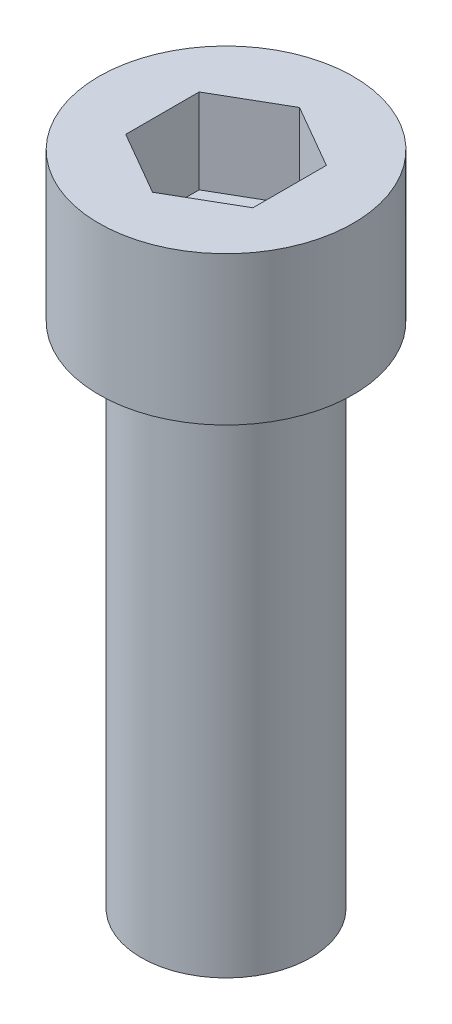
ISO-10303-21;
HEADER;
FILE_DESCRIPTION(('STEP AP214'),'2;1');
FILE_NAME('part.step','',(''),(''),'','','');
FILE_SCHEMA(('AUTOMOTIVE_DESIGN { 1 0 10303 214 1 1 1 1 }'));
ENDSEC;
DATA;
#1=APPLICATION_CONTEXT('core data for automotive mechanical design processes');
#2=APPLICATION_PROTOCOL_DEFINITION('international standard','automotive_design',2000,#1);
#3=PRODUCT_CONTEXT('',#1,'mechanical');
#4=PRODUCT('Part','Part','',(#3));
#5=PRODUCT_RELATED_PRODUCT_CATEGORY('part','',(#4));
#6=PRODUCT_DEFINITION_FORMATION('','',#4);
#7=PRODUCT_DEFINITION_CONTEXT('part definition',#1,'design');
#8=PRODUCT_DEFINITION('design','',#6,#7);
#9=PRODUCT_DEFINITION_SHAPE('','',#8);
#10=(LENGTH_UNIT() NAMED_UNIT(*) SI_UNIT(.MILLI.,.METRE.));
#11=(NAMED_UNIT(*) PLANE_ANGLE_UNIT() SI_UNIT($,.RADIAN.));
#12=(NAMED_UNIT(*) SI_UNIT($,.STERADIAN.) SOLID_ANGLE_UNIT());
#13=UNCERTAINTY_MEASURE_WITH_UNIT(LENGTH_MEASURE(1.E-05),#10,'distance_accuracy_value','');
#14=(GEOMETRIC_REPRESENTATION_CONTEXT(3) GLOBAL_UNCERTAINTY_ASSIGNED_CONTEXT((#13)) GLOBAL_UNIT_ASSIGNED_CONTEXT((#10,
#11,#12)) REPRESENTATION_CONTEXT('',''));
#15=CARTESIAN_POINT('',(0.,0.,0.));
#16=DIRECTION('',(0.,0.,1.));
#17=DIRECTION('',(1.,0.,0.));
#18=AXIS2_PLACEMENT_3D('',#15,#16,#17);
#19=CARTESIAN_POINT('',(3.,15.5,0.));
#20=DIRECTION('',(0.,-1.,0.));
#21=DIRECTION('',(1.,0.,0.));
#22=AXIS2_PLACEMENT_3D('',#19,#20,#21);
#23=PLANE('',#22);
#24=DIRECTION('',(0.866025403784438,0.,-0.5));
#25=VECTOR('',#24,1.);
#26=CARTESIAN_POINT('',(0.,15.5,1.73205080756888));
#27=LINE('',#26,#25);
#28=CARTESIAN_POINT('',(0.,15.5,1.73205080756888));
#29=VERTEX_POINT('',#28);
#30=CARTESIAN_POINT('',(1.5,15.5,0.866025403784438));
#31=VERTEX_POINT('',#30);
#32=EDGE_CURVE('E121',#29,#31,#27,.T.);
#33=ORIENTED_EDGE('',*,*,#32,.F.);
#34=DIRECTION('',(0.866025403784438,0.,0.5));
#35=VECTOR('',#34,1.);
#36=CARTESIAN_POINT('',(-1.5,15.5,0.866025403784438));
#37=LINE('',#36,#35);
#38=CARTESIAN_POINT('',(-1.5,15.5,0.866025403784438));
#39=VERTEX_POINT('',#38);
#40=EDGE_CURVE('E47',#39,#29,#37,.T.);
#41=ORIENTED_EDGE('',*,*,#40,.F.);
#42=DIRECTION('',(0.,0.,1.));
#43=VECTOR('',#42,1.);
#44=CARTESIAN_POINT('',(-1.5,15.5,-0.866025403784439));
#45=LINE('',#44,#43);
#46=CARTESIAN_POINT('',(-1.5,15.5,-0.866025403784439));
#47=VERTEX_POINT('',#46);
#48=EDGE_CURVE('E130',#47,#39,#45,.T.);
#49=ORIENTED_EDGE('',*,*,#48,.F.);
#50=DIRECTION('',(-0.866025403784439,0.,0.5));
#51=VECTOR('',#50,1.);
#52=CARTESIAN_POINT('',(0.,15.5,-1.73205080756888));
#53=LINE('',#52,#51);
#54=CARTESIAN_POINT('',(0.,15.5,-1.73205080756888));
#55=VERTEX_POINT('',#54);
#56=EDGE_CURVE('E128',#55,#47,#53,.T.);
#57=ORIENTED_EDGE('',*,*,#56,.F.);
#58=DIRECTION('',(-0.866025403784439,0.,-0.5));
#59=VECTOR('',#58,1.);
#60=CARTESIAN_POINT('',(1.5,15.5,-0.86602540378444));
#61=LINE('',#60,#59);
#62=CARTESIAN_POINT('',(1.5,15.5,-0.86602540378444));
#63=VERTEX_POINT('',#62);
#64=EDGE_CURVE('E95',#63,#55,#61,.T.);
#65=ORIENTED_EDGE('',*,*,#64,.F.);
#66=DIRECTION('',(0.,0.,-1.));
#67=VECTOR('',#66,1.);
#68=CARTESIAN_POINT('',(1.5,15.5,0.866025403784438));
#69=LINE('',#68,#67);
#70=EDGE_CURVE('E124',#31,#63,#69,.T.);
#71=ORIENTED_EDGE('',*,*,#70,.F.);
#72=EDGE_LOOP('',(#33,#41,#49,#57,#65,#71));
#73=FACE_BOUND('',#72,.T.);
#74=CARTESIAN_POINT('',(0.,15.5,0.));
#75=DIRECTION('',(0.,1.,0.));
#76=DIRECTION('',(-1.,0.,0.));
#77=AXIS2_PLACEMENT_3D('',#74,#75,#76);
#78=CIRCLE('',#77,3.);
#79=CARTESIAN_POINT('',(-3.,15.5,0.));
#80=VERTEX_POINT('',#79);
#81=EDGE_CURVE('E134',#80,#80,#78,.T.);
#82=ORIENTED_EDGE('',*,*,#81,.T.);
#83=EDGE_LOOP('',(#82));
#84=FACE_BOUND('',#83,.T.);
#85=ADVANCED_FACE('F33',(#73,#84),#23,.F.);
#86=CARTESIAN_POINT('',(0.,0.,0.));
#87=DIRECTION('',(0.,1.,0.));
#88=DIRECTION('',(-1.,0.,0.));
#89=AXIS2_PLACEMENT_3D('',#86,#87,#88);
#90=PLANE('',#89);
#91=CARTESIAN_POINT('',(0.,0.,0.));
#92=DIRECTION('',(0.,1.,0.));
#93=DIRECTION('',(-1.,0.,0.));
#94=AXIS2_PLACEMENT_3D('',#91,#92,#93);
#95=CIRCLE('',#94,2.);
#96=CARTESIAN_POINT('',(-2.,0.,0.));
#97=VERTEX_POINT('',#96);
#98=EDGE_CURVE('E11',#97,#97,#95,.T.);
#99=ORIENTED_EDGE('',*,*,#98,.F.);
#100=EDGE_LOOP('',(#99));
#101=FACE_BOUND('',#100,.T.);
#102=ADVANCED_FACE('F152',(#101),#90,.F.);
#103=CARTESIAN_POINT('',(0.,15.5,0.));
#104=DIRECTION('',(0.,1.,0.));
#105=DIRECTION('',(-1.,0.,0.));
#106=AXIS2_PLACEMENT_3D('',#103,#104,#105);
#107=CYLINDRICAL_SURFACE('',#106,2.);
#108=CARTESIAN_POINT('',(0.,12.,0.));
#109=DIRECTION('',(0.,1.,0.));
#110=DIRECTION('',(-1.,0.,0.));
#111=AXIS2_PLACEMENT_3D('',#108,#109,#110);
#112=CIRCLE('',#111,2.);
#113=CARTESIAN_POINT('',(-2.,12.,0.));
#114=VERTEX_POINT('',#113);
#115=EDGE_CURVE('E40',#114,#114,#112,.T.);
#116=ORIENTED_EDGE('',*,*,#115,.F.);
#117=EDGE_LOOP('',(#116));
#118=FACE_BOUND('',#117,.T.);
#119=ORIENTED_EDGE('',*,*,#98,.T.);
#120=EDGE_LOOP('',(#119));
#121=FACE_BOUND('',#120,.T.);
#122=ADVANCED_FACE('F149',(#118,#121),#107,.T.);
#123=CARTESIAN_POINT('',(2.,12.,0.));
#124=DIRECTION('',(0.,1.,0.));
#125=DIRECTION('',(-1.,0.,0.));
#126=AXIS2_PLACEMENT_3D('',#123,#124,#125);
#127=PLANE('',#126);
#128=CARTESIAN_POINT('',(0.,12.,0.));
#129=DIRECTION('',(0.,1.,0.));
#130=DIRECTION('',(-1.,0.,0.));
#131=AXIS2_PLACEMENT_3D('',#128,#129,#130);
#132=CIRCLE('',#131,3.);
#133=CARTESIAN_POINT('',(-3.,12.,0.));
#134=VERTEX_POINT('',#133);
#135=EDGE_CURVE('E142',#134,#134,#132,.T.);
#136=ORIENTED_EDGE('',*,*,#135,.F.);
#137=EDGE_LOOP('',(#136));
#138=FACE_BOUND('',#137,.T.);
#139=ORIENTED_EDGE('',*,*,#115,.T.);
#140=EDGE_LOOP('',(#139));
#141=FACE_BOUND('',#140,.T.);
#142=ADVANCED_FACE('F147',(#138,#141),#127,.F.);
#143=CARTESIAN_POINT('',(0.,15.5,0.));
#144=DIRECTION('',(0.,1.,0.));
#145=DIRECTION('',(-1.,0.,0.));
#146=AXIS2_PLACEMENT_3D('',#143,#144,#145);
#147=CYLINDRICAL_SURFACE('',#146,3.);
#148=ORIENTED_EDGE('',*,*,#81,.F.);
#149=EDGE_LOOP('',(#148));
#150=FACE_BOUND('',#149,.T.);
#151=ORIENTED_EDGE('',*,*,#135,.T.);
#152=EDGE_LOOP('',(#151));
#153=FACE_BOUND('',#152,.T.);
#154=ADVANCED_FACE('F164',(#150,#153),#147,.T.);
#155=CARTESIAN_POINT('',(-1.5,13.5,0.866025403784438));
#156=DIRECTION('',(-0.5,0.,0.866025403784439));
#157=DIRECTION('',(0.866025403784438,0.,0.5));
#158=AXIS2_PLACEMENT_3D('',#155,#156,#157);
#159=PLANE('',#158);
#160=ORIENTED_EDGE('',*,*,#40,.T.);
#161=DIRECTION('',(0.,1.,0.));
#162=VECTOR('',#161,1.);
#163=CARTESIAN_POINT('',(0.,13.5,1.73205080756888));
#164=LINE('',#163,#162);
#165=CARTESIAN_POINT('',(0.,13.5,1.73205080756888));
#166=VERTEX_POINT('',#165);
#167=EDGE_CURVE('E77',#166,#29,#164,.T.);
#168=ORIENTED_EDGE('',*,*,#167,.F.);
#169=DIRECTION('',(0.866025403784438,0.,0.5));
#170=VECTOR('',#169,1.);
#171=CARTESIAN_POINT('',(-1.5,13.5,0.866025403784438));
#172=LINE('',#171,#170);
#173=CARTESIAN_POINT('',(-1.5,13.5,0.866025403784438));
#174=VERTEX_POINT('',#173);
#175=EDGE_CURVE('E132',#174,#166,#172,.T.);
#176=ORIENTED_EDGE('',*,*,#175,.F.);
#177=DIRECTION('',(0.,1.,0.));
#178=VECTOR('',#177,1.);
#179=CARTESIAN_POINT('',(-1.5,13.5,0.866025403784438));
#180=LINE('',#179,#178);
#181=EDGE_CURVE('E55',#174,#39,#180,.T.);
#182=ORIENTED_EDGE('',*,*,#181,.T.);
#183=EDGE_LOOP('',(#160,#168,#176,#182));
#184=FACE_BOUND('',#183,.T.);
#185=ADVANCED_FACE('F168',(#184),#159,.F.);
#186=CARTESIAN_POINT('',(-1.5,13.5,-0.866025403784439));
#187=DIRECTION('',(-1.,0.,0.));
#188=DIRECTION('',(0.,0.,1.));
#189=AXIS2_PLACEMENT_3D('',#186,#187,#188);
#190=PLANE('',#189);
#191=ORIENTED_EDGE('',*,*,#48,.T.);
#192=ORIENTED_EDGE('',*,*,#181,.F.);
#193=DIRECTION('',(0.,0.,1.));
#194=VECTOR('',#193,1.);
#195=CARTESIAN_POINT('',(-1.5,13.5,-0.866025403784439));
#196=LINE('',#195,#194);
#197=CARTESIAN_POINT('',(-1.5,13.5,-0.866025403784439));
#198=VERTEX_POINT('',#197);
#199=EDGE_CURVE('E107',#198,#174,#196,.T.);
#200=ORIENTED_EDGE('',*,*,#199,.F.);
#201=DIRECTION('',(0.,1.,0.));
#202=VECTOR('',#201,1.);
#203=CARTESIAN_POINT('',(-1.5,13.5,-0.866025403784439));
#204=LINE('',#203,#202);
#205=EDGE_CURVE('E99',#198,#47,#204,.T.);
#206=ORIENTED_EDGE('',*,*,#205,.T.);
#207=EDGE_LOOP('',(#191,#192,#200,#206));
#208=FACE_BOUND('',#207,.T.);
#209=ADVANCED_FACE('F172',(#208),#190,.F.);
#210=CARTESIAN_POINT('',(0.,13.5,-1.73205080756888));
#211=DIRECTION('',(-0.5,0.,-0.866025403784439));
#212=DIRECTION('',(-0.866025403784439,0.,0.5));
#213=AXIS2_PLACEMENT_3D('',#210,#211,#212);
#214=PLANE('',#213);
#215=ORIENTED_EDGE('',*,*,#56,.T.);
#216=ORIENTED_EDGE('',*,*,#205,.F.);
#217=DIRECTION('',(-0.866025403784439,0.,0.5));
#218=VECTOR('',#217,1.);
#219=CARTESIAN_POINT('',(0.,13.5,-1.73205080756888));
#220=LINE('',#219,#218);
#221=CARTESIAN_POINT('',(0.,13.5,-1.73205080756888));
#222=VERTEX_POINT('',#221);
#223=EDGE_CURVE('E103',#222,#198,#220,.T.);
#224=ORIENTED_EDGE('',*,*,#223,.F.);
#225=DIRECTION('',(0.,1.,0.));
#226=VECTOR('',#225,1.);
#227=CARTESIAN_POINT('',(0.,13.5,-1.73205080756888));
#228=LINE('',#227,#226);
#229=EDGE_CURVE('E88',#222,#55,#228,.T.);
#230=ORIENTED_EDGE('',*,*,#229,.T.);
#231=EDGE_LOOP('',(#215,#216,#224,#230));
#232=FACE_BOUND('',#231,.T.);
#233=ADVANCED_FACE('F104',(#232),#214,.F.);
#234=CARTESIAN_POINT('',(1.5,13.5,-0.86602540378444));
#235=DIRECTION('',(0.5,0.,-0.866025403784439));
#236=DIRECTION('',(-0.866025403784439,0.,-0.5));
#237=AXIS2_PLACEMENT_3D('',#234,#235,#236);
#238=PLANE('',#237);
#239=ORIENTED_EDGE('',*,*,#64,.T.);
#240=ORIENTED_EDGE('',*,*,#229,.F.);
#241=DIRECTION('',(-0.866025403784439,0.,-0.5));
#242=VECTOR('',#241,1.);
#243=CARTESIAN_POINT('',(1.5,13.5,-0.86602540378444));
#244=LINE('',#243,#242);
#245=CARTESIAN_POINT('',(1.5,13.5,-0.86602540378444));
#246=VERTEX_POINT('',#245);
#247=EDGE_CURVE('E92',#246,#222,#244,.T.);
#248=ORIENTED_EDGE('',*,*,#247,.F.);
#249=DIRECTION('',(0.,1.,0.));
#250=VECTOR('',#249,1.);
#251=CARTESIAN_POINT('',(1.5,13.5,-0.86602540378444));
#252=LINE('',#251,#250);
#253=EDGE_CURVE('E100',#246,#63,#252,.T.);
#254=ORIENTED_EDGE('',*,*,#253,.T.);
#255=EDGE_LOOP('',(#239,#240,#248,#254));
#256=FACE_BOUND('',#255,.T.);
#257=ADVANCED_FACE('F90',(#256),#238,.F.);
#258=CARTESIAN_POINT('',(1.5,13.5,0.866025403784438));
#259=DIRECTION('',(1.,0.,0.));
#260=DIRECTION('',(0.,1.,0.));
#261=AXIS2_PLACEMENT_3D('',#258,#259,#260);
#262=PLANE('',#261);
#263=ORIENTED_EDGE('',*,*,#70,.T.);
#264=ORIENTED_EDGE('',*,*,#253,.F.);
#265=DIRECTION('',(0.,0.,-1.));
#266=VECTOR('',#265,1.);
#267=CARTESIAN_POINT('',(1.5,13.5,0.866025403784438));
#268=LINE('',#267,#266);
#269=CARTESIAN_POINT('',(1.5,13.5,0.866025403784438));
#270=VERTEX_POINT('',#269);
#271=EDGE_CURVE('E113',#270,#246,#268,.T.);
#272=ORIENTED_EDGE('',*,*,#271,.F.);
#273=DIRECTION('',(0.,1.,0.));
#274=VECTOR('',#273,1.);
#275=CARTESIAN_POINT('',(1.5,13.5,0.866025403784438));
#276=LINE('',#275,#274);
#277=EDGE_CURVE('E137',#270,#31,#276,.T.);
#278=ORIENTED_EDGE('',*,*,#277,.T.);
#279=EDGE_LOOP('',(#263,#264,#272,#278));
#280=FACE_BOUND('',#279,.T.);
#281=ADVANCED_FACE('F176',(#280),#262,.F.);
#282=CARTESIAN_POINT('',(0.,13.5,1.73205080756888));
#283=DIRECTION('',(0.5,0.,0.866025403784438));
#284=DIRECTION('',(0.866025403784438,0.,-0.5));
#285=AXIS2_PLACEMENT_3D('',#282,#283,#284);
#286=PLANE('',#285);
#287=ORIENTED_EDGE('',*,*,#32,.T.);
#288=ORIENTED_EDGE('',*,*,#277,.F.);
#289=DIRECTION('',(0.866025403784438,0.,-0.5));
#290=VECTOR('',#289,1.);
#291=CARTESIAN_POINT('',(0.,13.5,1.73205080756888));
#292=LINE('',#291,#290);
#293=EDGE_CURVE('E115',#166,#270,#292,.T.);
#294=ORIENTED_EDGE('',*,*,#293,.F.);
#295=ORIENTED_EDGE('',*,*,#167,.T.);
#296=EDGE_LOOP('',(#287,#288,#294,#295));
#297=FACE_BOUND('',#296,.T.);
#298=ADVANCED_FACE('F173',(#297),#286,.F.);
#299=CARTESIAN_POINT('',(0.,13.5,0.));
#300=DIRECTION('',(0.,1.,0.));
#301=DIRECTION('',(0.,0.,1.));
#302=AXIS2_PLACEMENT_3D('',#299,#300,#301);
#303=PLANE('',#302);
#304=ORIENTED_EDGE('',*,*,#175,.T.);
#305=ORIENTED_EDGE('',*,*,#293,.T.);
#306=ORIENTED_EDGE('',*,*,#271,.T.);
#307=ORIENTED_EDGE('',*,*,#247,.T.);
#308=ORIENTED_EDGE('',*,*,#223,.T.);
#309=ORIENTED_EDGE('',*,*,#199,.T.);
#310=EDGE_LOOP('',(#304,#305,#306,#307,#308,#309));
#311=FACE_BOUND('',#310,.T.);
#312=ADVANCED_FACE('F110',(#311),#303,.T.);
#313=CLOSED_SHELL('',(#85,#102,#122,#142,#154,#185,#209,#233,#257,#281,#298,#312));
#314=MANIFOLD_SOLID_BREP('B2',#313);
#315=ADVANCED_BREP_SHAPE_REPRESENTATION('',(#18,#314),#14);
#316=SHAPE_DEFINITION_REPRESENTATION(#9,#315);
ENDSEC;
END-ISO-10303-21;
